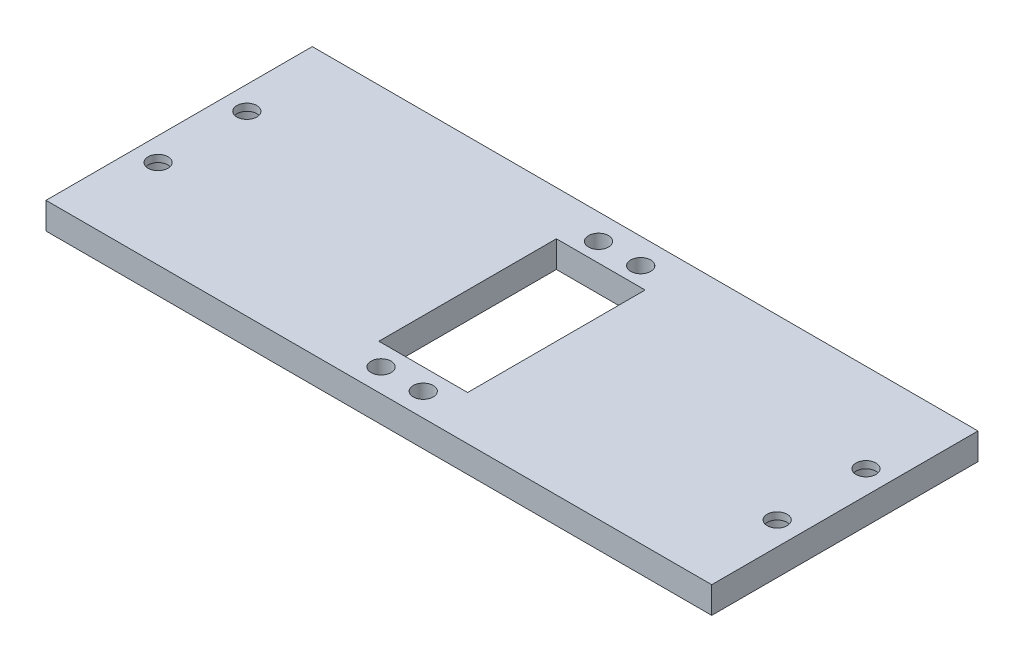
ISO-10303-21;
HEADER;
FILE_DESCRIPTION(('STEP AP214'),'2;1');
FILE_NAME('part.step','',(''),(''),'','','');
FILE_SCHEMA(('AUTOMOTIVE_DESIGN { 1 0 10303 214 1 1 1 1 }'));
ENDSEC;
DATA;
#1=APPLICATION_CONTEXT('core data for automotive mechanical design processes');
#2=APPLICATION_PROTOCOL_DEFINITION('international standard','automotive_design',2000,#1);
#3=PRODUCT_CONTEXT('',#1,'mechanical');
#4=PRODUCT('Part','Part','',(#3));
#5=PRODUCT_RELATED_PRODUCT_CATEGORY('part','',(#4));
#6=PRODUCT_DEFINITION_FORMATION('','',#4);
#7=PRODUCT_DEFINITION_CONTEXT('part definition',#1,'design');
#8=PRODUCT_DEFINITION('design','',#6,#7);
#9=PRODUCT_DEFINITION_SHAPE('','',#8);
#10=(LENGTH_UNIT() NAMED_UNIT(*) SI_UNIT(.MILLI.,.METRE.));
#11=(NAMED_UNIT(*) PLANE_ANGLE_UNIT() SI_UNIT($,.RADIAN.));
#12=(NAMED_UNIT(*) SI_UNIT($,.STERADIAN.) SOLID_ANGLE_UNIT());
#13=UNCERTAINTY_MEASURE_WITH_UNIT(LENGTH_MEASURE(1.E-05),#10,'distance_accuracy_value','');
#14=(GEOMETRIC_REPRESENTATION_CONTEXT(3) GLOBAL_UNCERTAINTY_ASSIGNED_CONTEXT((#13)) GLOBAL_UNIT_ASSIGNED_CONTEXT((#10,
#11,#12)) REPRESENTATION_CONTEXT('',''));
#15=CARTESIAN_POINT('',(0.,0.,0.));
#16=DIRECTION('',(0.,0.,1.));
#17=DIRECTION('',(1.,0.,0.));
#18=AXIS2_PLACEMENT_3D('',#15,#16,#17);
#19=CARTESIAN_POINT('',(0.,6.,0.));
#20=DIRECTION('',(0.,1.,0.));
#21=DIRECTION('',(0.,0.,1.));
#22=AXIS2_PLACEMENT_3D('',#19,#20,#21);
#23=PLANE('',#22);
#24=CARTESIAN_POINT('',(-4.74999999999999,6.00000000000001,24.75));
#25=DIRECTION('',(0.,1.,0.));
#26=DIRECTION('',(0.,0.,1.));
#27=AXIS2_PLACEMENT_3D('',#24,#25,#26);
#28=CIRCLE('',#27,2.24999999999999);
#29=CARTESIAN_POINT('',(-4.74999999999999,6.00000000000001,27.));
#30=VERTEX_POINT('',#29);
#31=EDGE_CURVE('E290',#30,#30,#28,.T.);
#32=ORIENTED_EDGE('',*,*,#31,.F.);
#33=EDGE_LOOP('',(#32));
#34=FACE_BOUND('',#33,.T.);
#35=CARTESIAN_POINT('',(4.75,6.00000000000001,24.75));
#36=DIRECTION('',(0.,1.,0.));
#37=DIRECTION('',(0.,0.,1.));
#38=AXIS2_PLACEMENT_3D('',#35,#36,#37);
#39=CIRCLE('',#38,2.24999999999999);
#40=CARTESIAN_POINT('',(4.75,6.00000000000001,27.));
#41=VERTEX_POINT('',#40);
#42=EDGE_CURVE('E294',#41,#41,#39,.T.);
#43=ORIENTED_EDGE('',*,*,#42,.F.);
#44=EDGE_LOOP('',(#43));
#45=FACE_BOUND('',#44,.T.);
#46=CARTESIAN_POINT('',(4.75000000000001,6.00000000000001,-24.25));
#47=DIRECTION('',(0.,1.,0.));
#48=DIRECTION('',(0.,0.,1.));
#49=AXIS2_PLACEMENT_3D('',#46,#47,#48);
#50=CIRCLE('',#49,2.24999999999999);
#51=CARTESIAN_POINT('',(4.75000000000001,6.00000000000001,-22.));
#52=VERTEX_POINT('',#51);
#53=EDGE_CURVE('E303',#52,#52,#50,.T.);
#54=ORIENTED_EDGE('',*,*,#53,.F.);
#55=EDGE_LOOP('',(#54));
#56=FACE_BOUND('',#55,.T.);
#57=CARTESIAN_POINT('',(-4.74999999999999,6.00000000000001,-24.25));
#58=DIRECTION('',(0.,1.,0.));
#59=DIRECTION('',(0.,0.,1.));
#60=AXIS2_PLACEMENT_3D('',#57,#58,#59);
#61=CIRCLE('',#60,2.24999999999999);
#62=CARTESIAN_POINT('',(-4.74999999999999,6.00000000000001,-22.));
#63=VERTEX_POINT('',#62);
#64=EDGE_CURVE('E306',#63,#63,#61,.T.);
#65=ORIENTED_EDGE('',*,*,#64,.F.);
#66=EDGE_LOOP('',(#65));
#67=FACE_BOUND('',#66,.T.);
#68=CARTESIAN_POINT('',(-69.75,6.00000000000001,9.99999999999995));
#69=DIRECTION('',(0.,-1.,0.));
#70=DIRECTION('',(0.,0.,-1.));
#71=AXIS2_PLACEMENT_3D('',#68,#69,#70);
#72=CIRCLE('',#71,2.25000000000002);
#73=CARTESIAN_POINT('',(-69.75,6.00000000000001,7.74999999999994));
#74=VERTEX_POINT('',#73);
#75=EDGE_CURVE('E321',#74,#74,#72,.T.);
#76=ORIENTED_EDGE('',*,*,#75,.T.);
#77=EDGE_LOOP('',(#76));
#78=FACE_BOUND('',#77,.T.);
#79=CARTESIAN_POINT('',(-69.75,6.00000000000001,-10.0000000000001));
#80=DIRECTION('',(0.,-1.,0.));
#81=DIRECTION('',(0.,0.,-1.));
#82=AXIS2_PLACEMENT_3D('',#79,#80,#81);
#83=CIRCLE('',#82,2.25000000000002);
#84=CARTESIAN_POINT('',(-69.75,6.00000000000001,-12.2500000000001));
#85=VERTEX_POINT('',#84);
#86=EDGE_CURVE('E333',#85,#85,#83,.T.);
#87=ORIENTED_EDGE('',*,*,#86,.T.);
#88=EDGE_LOOP('',(#87));
#89=FACE_BOUND('',#88,.T.);
#90=CARTESIAN_POINT('',(69.75,6.00000000000001,9.99999999999995));
#91=DIRECTION('',(0.,-1.,0.));
#92=DIRECTION('',(0.,0.,-1.));
#93=AXIS2_PLACEMENT_3D('',#90,#91,#92);
#94=CIRCLE('',#93,2.25000000000002);
#95=CARTESIAN_POINT('',(69.75,6.00000000000001,7.74999999999994));
#96=VERTEX_POINT('',#95);
#97=EDGE_CURVE('E345',#96,#96,#94,.T.);
#98=ORIENTED_EDGE('',*,*,#97,.T.);
#99=EDGE_LOOP('',(#98));
#100=FACE_BOUND('',#99,.T.);
#101=CARTESIAN_POINT('',(69.75,6.00000000000001,-10.0000000000001));
#102=DIRECTION('',(0.,-1.,0.));
#103=DIRECTION('',(0.,0.,-1.));
#104=AXIS2_PLACEMENT_3D('',#101,#102,#103);
#105=CIRCLE('',#104,2.25000000000002);
#106=CARTESIAN_POINT('',(69.75,6.00000000000001,-12.2500000000001));
#107=VERTEX_POINT('',#106);
#108=EDGE_CURVE('E132',#107,#107,#105,.T.);
#109=ORIENTED_EDGE('',*,*,#108,.T.);
#110=EDGE_LOOP('',(#109));
#111=FACE_BOUND('',#110,.T.);
#112=DIRECTION('',(0.,0.,1.));
#113=VECTOR('',#112,1.);
#114=CARTESIAN_POINT('',(-75.,6.,30.));
#115=LINE('',#114,#113);
#116=CARTESIAN_POINT('',(-75.,6.,-30.));
#117=VERTEX_POINT('',#116);
#118=CARTESIAN_POINT('',(-75.,6.,30.));
#119=VERTEX_POINT('',#118);
#120=EDGE_CURVE('E142',#117,#119,#115,.T.);
#121=ORIENTED_EDGE('',*,*,#120,.T.);
#122=DIRECTION('',(1.,0.,0.));
#123=VECTOR('',#122,1.);
#124=CARTESIAN_POINT('',(75.,6.,30.));
#125=LINE('',#124,#123);
#126=CARTESIAN_POINT('',(75.,6.,30.));
#127=VERTEX_POINT('',#126);
#128=EDGE_CURVE('E145',#119,#127,#125,.T.);
#129=ORIENTED_EDGE('',*,*,#128,.T.);
#130=DIRECTION('',(0.,0.,-1.));
#131=VECTOR('',#130,1.);
#132=CARTESIAN_POINT('',(75.,6.,30.));
#133=LINE('',#132,#131);
#134=CARTESIAN_POINT('',(75.,6.,-30.));
#135=VERTEX_POINT('',#134);
#136=EDGE_CURVE('E148',#127,#135,#133,.T.);
#137=ORIENTED_EDGE('',*,*,#136,.T.);
#138=DIRECTION('',(-1.,0.,0.));
#139=VECTOR('',#138,1.);
#140=CARTESIAN_POINT('',(75.,6.,-30.));
#141=LINE('',#140,#139);
#142=EDGE_CURVE('E150',#135,#117,#141,.T.);
#143=ORIENTED_EDGE('',*,*,#142,.T.);
#144=EDGE_LOOP('',(#121,#129,#137,#143));
#145=FACE_BOUND('',#144,.T.);
#146=DIRECTION('',(1.,0.,0.));
#147=VECTOR('',#146,1.);
#148=CARTESIAN_POINT('',(10.,6.,20.));
#149=LINE('',#148,#147);
#150=CARTESIAN_POINT('',(-9.99999999999999,6.,20.));
#151=VERTEX_POINT('',#150);
#152=CARTESIAN_POINT('',(10.,6.,20.));
#153=VERTEX_POINT('',#152);
#154=EDGE_CURVE('E112',#151,#153,#149,.T.);
#155=ORIENTED_EDGE('',*,*,#154,.F.);
#156=DIRECTION('',(0.,0.,1.));
#157=VECTOR('',#156,1.);
#158=CARTESIAN_POINT('',(-9.99999999999999,6.,20.));
#159=LINE('',#158,#157);
#160=CARTESIAN_POINT('',(-9.99999999999999,6.,-20.));
#161=VERTEX_POINT('',#160);
#162=EDGE_CURVE('E104',#161,#151,#159,.T.);
#163=ORIENTED_EDGE('',*,*,#162,.F.);
#164=DIRECTION('',(-1.,0.,0.));
#165=VECTOR('',#164,1.);
#166=CARTESIAN_POINT('',(10.,6.,-20.));
#167=LINE('',#166,#165);
#168=CARTESIAN_POINT('',(10.,6.,-20.));
#169=VERTEX_POINT('',#168);
#170=EDGE_CURVE('E126',#169,#161,#167,.T.);
#171=ORIENTED_EDGE('',*,*,#170,.F.);
#172=DIRECTION('',(0.,0.,-1.));
#173=VECTOR('',#172,1.);
#174=CARTESIAN_POINT('',(10.,6.,20.));
#175=LINE('',#174,#173);
#176=EDGE_CURVE('E124',#153,#169,#175,.T.);
#177=ORIENTED_EDGE('',*,*,#176,.F.);
#178=EDGE_LOOP('',(#155,#163,#171,#177));
#179=FACE_BOUND('',#178,.T.);
#180=ADVANCED_FACE('F38',(#34,#45,#56,#67,#78,#89,#100,#111,#145,#179),#23,.T.);
#181=CARTESIAN_POINT('',(0.,0.,0.));
#182=DIRECTION('',(0.,1.,0.));
#183=DIRECTION('',(0.,0.,1.));
#184=AXIS2_PLACEMENT_3D('',#181,#182,#183);
#185=PLANE('',#184);
#186=CARTESIAN_POINT('',(-4.74999999999999,0.,24.75));
#187=DIRECTION('',(0.,1.,0.));
#188=DIRECTION('',(0.,0.,1.));
#189=AXIS2_PLACEMENT_3D('',#186,#187,#188);
#190=CIRCLE('',#189,2.24999999999999);
#191=CARTESIAN_POINT('',(-4.74999999999999,0.,27.));
#192=VERTEX_POINT('',#191);
#193=EDGE_CURVE('E293',#192,#192,#190,.T.);
#194=ORIENTED_EDGE('',*,*,#193,.T.);
#195=EDGE_LOOP('',(#194));
#196=FACE_BOUND('',#195,.T.);
#197=CARTESIAN_POINT('',(4.75,0.,24.75));
#198=DIRECTION('',(0.,1.,0.));
#199=DIRECTION('',(0.,0.,1.));
#200=AXIS2_PLACEMENT_3D('',#197,#198,#199);
#201=CIRCLE('',#200,2.24999999999999);
#202=CARTESIAN_POINT('',(4.75,0.,27.));
#203=VERTEX_POINT('',#202);
#204=EDGE_CURVE('E297',#203,#203,#201,.T.);
#205=ORIENTED_EDGE('',*,*,#204,.T.);
#206=EDGE_LOOP('',(#205));
#207=FACE_BOUND('',#206,.T.);
#208=CARTESIAN_POINT('',(4.75000000000001,0.,-24.25));
#209=DIRECTION('',(0.,1.,0.));
#210=DIRECTION('',(0.,0.,1.));
#211=AXIS2_PLACEMENT_3D('',#208,#209,#210);
#212=CIRCLE('',#211,2.24999999999999);
#213=CARTESIAN_POINT('',(4.75000000000001,0.,-22.));
#214=VERTEX_POINT('',#213);
#215=EDGE_CURVE('E42',#214,#214,#212,.T.);
#216=ORIENTED_EDGE('',*,*,#215,.T.);
#217=EDGE_LOOP('',(#216));
#218=FACE_BOUND('',#217,.T.);
#219=CARTESIAN_POINT('',(-4.74999999999999,0.,-24.25));
#220=DIRECTION('',(0.,1.,0.));
#221=DIRECTION('',(0.,0.,1.));
#222=AXIS2_PLACEMENT_3D('',#219,#220,#221);
#223=CIRCLE('',#222,2.24999999999999);
#224=CARTESIAN_POINT('',(-4.74999999999999,0.,-22.));
#225=VERTEX_POINT('',#224);
#226=EDGE_CURVE('E309',#225,#225,#223,.T.);
#227=ORIENTED_EDGE('',*,*,#226,.T.);
#228=EDGE_LOOP('',(#227));
#229=FACE_BOUND('',#228,.T.);
#230=CARTESIAN_POINT('',(-69.75,0.,9.99999999999995));
#231=DIRECTION('',(0.,-1.,0.));
#232=DIRECTION('',(0.,0.,-1.));
#233=AXIS2_PLACEMENT_3D('',#230,#231,#232);
#234=CIRCLE('',#233,3.99999999999999);
#235=CARTESIAN_POINT('',(-69.75,0.,5.99999999999996));
#236=VERTEX_POINT('',#235);
#237=EDGE_CURVE('E312',#236,#236,#234,.T.);
#238=ORIENTED_EDGE('',*,*,#237,.F.);
#239=EDGE_LOOP('',(#238));
#240=FACE_BOUND('',#239,.T.);
#241=CARTESIAN_POINT('',(-69.75,0.,-10.0000000000001));
#242=DIRECTION('',(0.,-1.,0.));
#243=DIRECTION('',(0.,0.,-1.));
#244=AXIS2_PLACEMENT_3D('',#241,#242,#243);
#245=CIRCLE('',#244,3.99999999999999);
#246=CARTESIAN_POINT('',(-69.75,0.,-14.0000000000001));
#247=VERTEX_POINT('',#246);
#248=EDGE_CURVE('E324',#247,#247,#245,.T.);
#249=ORIENTED_EDGE('',*,*,#248,.F.);
#250=EDGE_LOOP('',(#249));
#251=FACE_BOUND('',#250,.T.);
#252=CARTESIAN_POINT('',(69.75,0.,9.99999999999995));
#253=DIRECTION('',(0.,-1.,0.));
#254=DIRECTION('',(0.,0.,-1.));
#255=AXIS2_PLACEMENT_3D('',#252,#253,#254);
#256=CIRCLE('',#255,3.99999999999999);
#257=CARTESIAN_POINT('',(69.75,0.,5.99999999999996));
#258=VERTEX_POINT('',#257);
#259=EDGE_CURVE('E336',#258,#258,#256,.T.);
#260=ORIENTED_EDGE('',*,*,#259,.F.);
#261=EDGE_LOOP('',(#260));
#262=FACE_BOUND('',#261,.T.);
#263=CARTESIAN_POINT('',(69.75,0.,-10.0000000000001));
#264=DIRECTION('',(0.,-1.,0.));
#265=DIRECTION('',(0.,0.,-1.));
#266=AXIS2_PLACEMENT_3D('',#263,#264,#265);
#267=CIRCLE('',#266,3.99999999999999);
#268=CARTESIAN_POINT('',(69.75,0.,-14.0000000000001));
#269=VERTEX_POINT('',#268);
#270=EDGE_CURVE('E348',#269,#269,#267,.T.);
#271=ORIENTED_EDGE('',*,*,#270,.F.);
#272=EDGE_LOOP('',(#271));
#273=FACE_BOUND('',#272,.T.);
#274=DIRECTION('',(0.,0.,1.));
#275=VECTOR('',#274,1.);
#276=CARTESIAN_POINT('',(-75.,0.,30.));
#277=LINE('',#276,#275);
#278=CARTESIAN_POINT('',(-75.,0.,-30.));
#279=VERTEX_POINT('',#278);
#280=CARTESIAN_POINT('',(-75.,0.,30.));
#281=VERTEX_POINT('',#280);
#282=EDGE_CURVE('E120',#279,#281,#277,.T.);
#283=ORIENTED_EDGE('',*,*,#282,.F.);
#284=DIRECTION('',(-1.,0.,0.));
#285=VECTOR('',#284,1.);
#286=CARTESIAN_POINT('',(75.,0.,-30.));
#287=LINE('',#286,#285);
#288=CARTESIAN_POINT('',(75.,0.,-30.));
#289=VERTEX_POINT('',#288);
#290=EDGE_CURVE('E146',#289,#279,#287,.T.);
#291=ORIENTED_EDGE('',*,*,#290,.F.);
#292=DIRECTION('',(0.,0.,-1.));
#293=VECTOR('',#292,1.);
#294=CARTESIAN_POINT('',(75.,0.,30.));
#295=LINE('',#294,#293);
#296=CARTESIAN_POINT('',(75.,0.,30.));
#297=VERTEX_POINT('',#296);
#298=EDGE_CURVE('E157',#297,#289,#295,.T.);
#299=ORIENTED_EDGE('',*,*,#298,.F.);
#300=DIRECTION('',(1.,0.,0.));
#301=VECTOR('',#300,1.);
#302=CARTESIAN_POINT('',(75.,0.,30.));
#303=LINE('',#302,#301);
#304=EDGE_CURVE('E155',#281,#297,#303,.T.);
#305=ORIENTED_EDGE('',*,*,#304,.F.);
#306=EDGE_LOOP('',(#283,#291,#299,#305));
#307=FACE_BOUND('',#306,.T.);
#308=DIRECTION('',(0.,0.,1.));
#309=VECTOR('',#308,1.);
#310=CARTESIAN_POINT('',(-9.99999999999999,0.,20.));
#311=LINE('',#310,#309);
#312=CARTESIAN_POINT('',(-9.99999999999999,0.,-20.));
#313=VERTEX_POINT('',#312);
#314=CARTESIAN_POINT('',(-9.99999999999999,0.,20.));
#315=VERTEX_POINT('',#314);
#316=EDGE_CURVE('E62',#313,#315,#311,.T.);
#317=ORIENTED_EDGE('',*,*,#316,.T.);
#318=DIRECTION('',(1.,0.,0.));
#319=VECTOR('',#318,1.);
#320=CARTESIAN_POINT('',(10.,0.,20.));
#321=LINE('',#320,#319);
#322=CARTESIAN_POINT('',(10.,0.,20.));
#323=VERTEX_POINT('',#322);
#324=EDGE_CURVE('E119',#315,#323,#321,.T.);
#325=ORIENTED_EDGE('',*,*,#324,.T.);
#326=DIRECTION('',(0.,0.,-1.));
#327=VECTOR('',#326,1.);
#328=CARTESIAN_POINT('',(10.,0.,20.));
#329=LINE('',#328,#327);
#330=CARTESIAN_POINT('',(10.,0.,-20.));
#331=VERTEX_POINT('',#330);
#332=EDGE_CURVE('E134',#323,#331,#329,.T.);
#333=ORIENTED_EDGE('',*,*,#332,.T.);
#334=DIRECTION('',(-1.,0.,0.));
#335=VECTOR('',#334,1.);
#336=CARTESIAN_POINT('',(10.,0.,-20.));
#337=LINE('',#336,#335);
#338=EDGE_CURVE('E113',#331,#313,#337,.T.);
#339=ORIENTED_EDGE('',*,*,#338,.T.);
#340=EDGE_LOOP('',(#317,#325,#333,#339));
#341=FACE_BOUND('',#340,.T.);
#342=ADVANCED_FACE('F176',(#196,#207,#218,#229,#240,#251,#262,#273,#307,#341),#185,.F.);
#343=CARTESIAN_POINT('',(-75.,6.,30.));
#344=DIRECTION('',(1.,0.,0.));
#345=DIRECTION('',(0.,0.,-1.));
#346=AXIS2_PLACEMENT_3D('',#343,#344,#345);
#347=PLANE('',#346);
#348=ORIENTED_EDGE('',*,*,#282,.T.);
#349=DIRECTION('',(0.,-1.,0.));
#350=VECTOR('',#349,1.);
#351=CARTESIAN_POINT('',(-75.,6.,30.));
#352=LINE('',#351,#350);
#353=EDGE_CURVE('E11',#119,#281,#352,.T.);
#354=ORIENTED_EDGE('',*,*,#353,.F.);
#355=ORIENTED_EDGE('',*,*,#120,.F.);
#356=DIRECTION('',(0.,-1.,0.));
#357=VECTOR('',#356,1.);
#358=CARTESIAN_POINT('',(-75.,6.,-30.));
#359=LINE('',#358,#357);
#360=EDGE_CURVE('E152',#117,#279,#359,.T.);
#361=ORIENTED_EDGE('',*,*,#360,.T.);
#362=EDGE_LOOP('',(#348,#354,#355,#361));
#363=FACE_BOUND('',#362,.T.);
#364=ADVANCED_FACE('F40',(#363),#347,.F.);
#365=CARTESIAN_POINT('',(75.,6.,30.));
#366=DIRECTION('',(0.,0.,-1.));
#367=DIRECTION('',(-1.,0.,0.));
#368=AXIS2_PLACEMENT_3D('',#365,#366,#367);
#369=PLANE('',#368);
#370=ORIENTED_EDGE('',*,*,#304,.T.);
#371=DIRECTION('',(0.,-1.,0.));
#372=VECTOR('',#371,1.);
#373=CARTESIAN_POINT('',(75.,6.,30.));
#374=LINE('',#373,#372);
#375=EDGE_CURVE('E47',#127,#297,#374,.T.);
#376=ORIENTED_EDGE('',*,*,#375,.F.);
#377=ORIENTED_EDGE('',*,*,#128,.F.);
#378=ORIENTED_EDGE('',*,*,#353,.T.);
#379=EDGE_LOOP('',(#370,#376,#377,#378));
#380=FACE_BOUND('',#379,.T.);
#381=ADVANCED_FACE('F186',(#380),#369,.F.);
#382=CARTESIAN_POINT('',(75.,6.,30.));
#383=DIRECTION('',(-1.,0.,0.));
#384=DIRECTION('',(0.,0.,1.));
#385=AXIS2_PLACEMENT_3D('',#382,#383,#384);
#386=PLANE('',#385);
#387=ORIENTED_EDGE('',*,*,#298,.T.);
#388=DIRECTION('',(0.,-1.,0.));
#389=VECTOR('',#388,1.);
#390=CARTESIAN_POINT('',(75.,6.,-30.));
#391=LINE('',#390,#389);
#392=EDGE_CURVE('E162',#135,#289,#391,.T.);
#393=ORIENTED_EDGE('',*,*,#392,.F.);
#394=ORIENTED_EDGE('',*,*,#136,.F.);
#395=ORIENTED_EDGE('',*,*,#375,.T.);
#396=EDGE_LOOP('',(#387,#393,#394,#395));
#397=FACE_BOUND('',#396,.T.);
#398=ADVANCED_FACE('F170',(#397),#386,.F.);
#399=CARTESIAN_POINT('',(75.,6.,-30.));
#400=DIRECTION('',(0.,0.,1.));
#401=DIRECTION('',(1.,0.,0.));
#402=AXIS2_PLACEMENT_3D('',#399,#400,#401);
#403=PLANE('',#402);
#404=ORIENTED_EDGE('',*,*,#290,.T.);
#405=ORIENTED_EDGE('',*,*,#360,.F.);
#406=ORIENTED_EDGE('',*,*,#142,.F.);
#407=ORIENTED_EDGE('',*,*,#392,.T.);
#408=EDGE_LOOP('',(#404,#405,#406,#407));
#409=FACE_BOUND('',#408,.T.);
#410=ADVANCED_FACE('F180',(#409),#403,.F.);
#411=CARTESIAN_POINT('',(-9.99999999999999,6.,20.));
#412=DIRECTION('',(1.,0.,0.));
#413=DIRECTION('',(0.,0.,-1.));
#414=AXIS2_PLACEMENT_3D('',#411,#412,#413);
#415=PLANE('',#414);
#416=ORIENTED_EDGE('',*,*,#316,.F.);
#417=DIRECTION('',(0.,-1.,0.));
#418=VECTOR('',#417,1.);
#419=CARTESIAN_POINT('',(-9.99999999999999,6.,-20.));
#420=LINE('',#419,#418);
#421=EDGE_CURVE('E108',#161,#313,#420,.T.);
#422=ORIENTED_EDGE('',*,*,#421,.F.);
#423=ORIENTED_EDGE('',*,*,#162,.T.);
#424=DIRECTION('',(0.,-1.,0.));
#425=VECTOR('',#424,1.);
#426=CARTESIAN_POINT('',(-9.99999999999999,6.,20.));
#427=LINE('',#426,#425);
#428=EDGE_CURVE('E107',#151,#315,#427,.T.);
#429=ORIENTED_EDGE('',*,*,#428,.T.);
#430=EDGE_LOOP('',(#416,#422,#423,#429));
#431=FACE_BOUND('',#430,.T.);
#432=ADVANCED_FACE('F106',(#431),#415,.T.);
#433=CARTESIAN_POINT('',(10.,6.,20.));
#434=DIRECTION('',(0.,0.,-1.));
#435=DIRECTION('',(-1.,0.,0.));
#436=AXIS2_PLACEMENT_3D('',#433,#434,#435);
#437=PLANE('',#436);
#438=ORIENTED_EDGE('',*,*,#324,.F.);
#439=ORIENTED_EDGE('',*,*,#428,.F.);
#440=ORIENTED_EDGE('',*,*,#154,.T.);
#441=DIRECTION('',(0.,-1.,0.));
#442=VECTOR('',#441,1.);
#443=CARTESIAN_POINT('',(10.,6.,20.));
#444=LINE('',#443,#442);
#445=EDGE_CURVE('E121',#153,#323,#444,.T.);
#446=ORIENTED_EDGE('',*,*,#445,.T.);
#447=EDGE_LOOP('',(#438,#439,#440,#446));
#448=FACE_BOUND('',#447,.T.);
#449=ADVANCED_FACE('F116',(#448),#437,.T.);
#450=CARTESIAN_POINT('',(10.,6.,20.));
#451=DIRECTION('',(-1.,0.,0.));
#452=DIRECTION('',(0.,0.,1.));
#453=AXIS2_PLACEMENT_3D('',#450,#451,#452);
#454=PLANE('',#453);
#455=ORIENTED_EDGE('',*,*,#332,.F.);
#456=ORIENTED_EDGE('',*,*,#445,.F.);
#457=ORIENTED_EDGE('',*,*,#176,.T.);
#458=DIRECTION('',(0.,-1.,0.));
#459=VECTOR('',#458,1.);
#460=CARTESIAN_POINT('',(10.,6.,-20.));
#461=LINE('',#460,#459);
#462=EDGE_CURVE('E54',#169,#331,#461,.T.);
#463=ORIENTED_EDGE('',*,*,#462,.T.);
#464=EDGE_LOOP('',(#455,#456,#457,#463));
#465=FACE_BOUND('',#464,.T.);
#466=ADVANCED_FACE('F213',(#465),#454,.T.);
#467=CARTESIAN_POINT('',(10.,6.,-20.));
#468=DIRECTION('',(0.,0.,1.));
#469=DIRECTION('',(1.,0.,0.));
#470=AXIS2_PLACEMENT_3D('',#467,#468,#469);
#471=PLANE('',#470);
#472=ORIENTED_EDGE('',*,*,#338,.F.);
#473=ORIENTED_EDGE('',*,*,#462,.F.);
#474=ORIENTED_EDGE('',*,*,#170,.T.);
#475=ORIENTED_EDGE('',*,*,#421,.T.);
#476=EDGE_LOOP('',(#472,#473,#474,#475));
#477=FACE_BOUND('',#476,.T.);
#478=ADVANCED_FACE('F217',(#477),#471,.T.);
#479=CARTESIAN_POINT('',(69.75,0.,-10.0000000000001));
#480=DIRECTION('',(0.,-1.,0.));
#481=DIRECTION('',(0.,0.,-1.));
#482=AXIS2_PLACEMENT_3D('',#479,#480,#481);
#483=CYLINDRICAL_SURFACE('',#482,2.25000000000002);
#484=ORIENTED_EDGE('',*,*,#108,.F.);
#485=EDGE_LOOP('',(#484));
#486=FACE_BOUND('',#485,.T.);
#487=CARTESIAN_POINT('',(69.75,4.4,-10.0000000000001));
#488=DIRECTION('',(0.,-1.,0.));
#489=DIRECTION('',(0.,0.,-1.));
#490=AXIS2_PLACEMENT_3D('',#487,#488,#489);
#491=CIRCLE('',#490,2.25000000000002);
#492=CARTESIAN_POINT('',(69.75,4.4,-12.2500000000001));
#493=VERTEX_POINT('',#492);
#494=EDGE_CURVE('E354',#493,#493,#491,.T.);
#495=ORIENTED_EDGE('',*,*,#494,.T.);
#496=EDGE_LOOP('',(#495));
#497=FACE_BOUND('',#496,.T.);
#498=ADVANCED_FACE('F223',(#486,#497),#483,.F.);
#499=CARTESIAN_POINT('',(72.,4.4,-10.0000000000001));
#500=DIRECTION('',(0.,1.,0.));
#501=DIRECTION('',(0.,0.,1.));
#502=AXIS2_PLACEMENT_3D('',#499,#500,#501);
#503=PLANE('',#502);
#504=ORIENTED_EDGE('',*,*,#494,.F.);
#505=EDGE_LOOP('',(#504));
#506=FACE_BOUND('',#505,.T.);
#507=CARTESIAN_POINT('',(69.75,4.4,-10.0000000000001));
#508=DIRECTION('',(0.,-1.,0.));
#509=DIRECTION('',(0.,0.,-1.));
#510=AXIS2_PLACEMENT_3D('',#507,#508,#509);
#511=CIRCLE('',#510,3.99999999999999);
#512=CARTESIAN_POINT('',(69.75,4.4,-14.0000000000001));
#513=VERTEX_POINT('',#512);
#514=EDGE_CURVE('E351',#513,#513,#511,.T.);
#515=ORIENTED_EDGE('',*,*,#514,.T.);
#516=EDGE_LOOP('',(#515));
#517=FACE_BOUND('',#516,.T.);
#518=ADVANCED_FACE('F226',(#506,#517),#503,.F.);
#519=CARTESIAN_POINT('',(69.75,0.,-10.0000000000001));
#520=DIRECTION('',(0.,-1.,0.));
#521=DIRECTION('',(0.,0.,-1.));
#522=AXIS2_PLACEMENT_3D('',#519,#520,#521);
#523=CYLINDRICAL_SURFACE('',#522,3.99999999999999);
#524=ORIENTED_EDGE('',*,*,#514,.F.);
#525=EDGE_LOOP('',(#524));
#526=FACE_BOUND('',#525,.T.);
#527=ORIENTED_EDGE('',*,*,#270,.T.);
#528=EDGE_LOOP('',(#527));
#529=FACE_BOUND('',#528,.T.);
#530=ADVANCED_FACE('F230',(#526,#529),#523,.F.);
#531=CARTESIAN_POINT('',(69.75,0.,9.99999999999995));
#532=DIRECTION('',(0.,-1.,0.));
#533=DIRECTION('',(0.,0.,-1.));
#534=AXIS2_PLACEMENT_3D('',#531,#532,#533);
#535=CYLINDRICAL_SURFACE('',#534,2.25000000000002);
#536=ORIENTED_EDGE('',*,*,#97,.F.);
#537=EDGE_LOOP('',(#536));
#538=FACE_BOUND('',#537,.T.);
#539=CARTESIAN_POINT('',(69.75,4.4,9.99999999999995));
#540=DIRECTION('',(0.,-1.,0.));
#541=DIRECTION('',(0.,0.,-1.));
#542=AXIS2_PLACEMENT_3D('',#539,#540,#541);
#543=CIRCLE('',#542,2.25000000000002);
#544=CARTESIAN_POINT('',(69.75,4.4,7.74999999999994));
#545=VERTEX_POINT('',#544);
#546=EDGE_CURVE('E342',#545,#545,#543,.T.);
#547=ORIENTED_EDGE('',*,*,#546,.T.);
#548=EDGE_LOOP('',(#547));
#549=FACE_BOUND('',#548,.T.);
#550=ADVANCED_FACE('F234',(#538,#549),#535,.F.);
#551=CARTESIAN_POINT('',(72.,4.4,9.99999999999995));
#552=DIRECTION('',(0.,1.,0.));
#553=DIRECTION('',(0.,0.,1.));
#554=AXIS2_PLACEMENT_3D('',#551,#552,#553);
#555=PLANE('',#554);
#556=ORIENTED_EDGE('',*,*,#546,.F.);
#557=EDGE_LOOP('',(#556));
#558=FACE_BOUND('',#557,.T.);
#559=CARTESIAN_POINT('',(69.75,4.4,9.99999999999995));
#560=DIRECTION('',(0.,-1.,0.));
#561=DIRECTION('',(0.,0.,-1.));
#562=AXIS2_PLACEMENT_3D('',#559,#560,#561);
#563=CIRCLE('',#562,3.99999999999999);
#564=CARTESIAN_POINT('',(69.75,4.4,5.99999999999996));
#565=VERTEX_POINT('',#564);
#566=EDGE_CURVE('E339',#565,#565,#563,.T.);
#567=ORIENTED_EDGE('',*,*,#566,.T.);
#568=EDGE_LOOP('',(#567));
#569=FACE_BOUND('',#568,.T.);
#570=ADVANCED_FACE('F238',(#558,#569),#555,.F.);
#571=CARTESIAN_POINT('',(69.75,0.,9.99999999999995));
#572=DIRECTION('',(0.,-1.,0.));
#573=DIRECTION('',(0.,0.,-1.));
#574=AXIS2_PLACEMENT_3D('',#571,#572,#573);
#575=CYLINDRICAL_SURFACE('',#574,3.99999999999999);
#576=ORIENTED_EDGE('',*,*,#566,.F.);
#577=EDGE_LOOP('',(#576));
#578=FACE_BOUND('',#577,.T.);
#579=ORIENTED_EDGE('',*,*,#259,.T.);
#580=EDGE_LOOP('',(#579));
#581=FACE_BOUND('',#580,.T.);
#582=ADVANCED_FACE('F242',(#578,#581),#575,.F.);
#583=CARTESIAN_POINT('',(-69.75,0.,-10.0000000000001));
#584=DIRECTION('',(0.,-1.,0.));
#585=DIRECTION('',(0.,0.,-1.));
#586=AXIS2_PLACEMENT_3D('',#583,#584,#585);
#587=CYLINDRICAL_SURFACE('',#586,2.25000000000002);
#588=ORIENTED_EDGE('',*,*,#86,.F.);
#589=EDGE_LOOP('',(#588));
#590=FACE_BOUND('',#589,.T.);
#591=CARTESIAN_POINT('',(-69.75,4.4,-10.0000000000001));
#592=DIRECTION('',(0.,-1.,0.));
#593=DIRECTION('',(0.,0.,-1.));
#594=AXIS2_PLACEMENT_3D('',#591,#592,#593);
#595=CIRCLE('',#594,2.25000000000002);
#596=CARTESIAN_POINT('',(-69.75,4.4,-12.2500000000001));
#597=VERTEX_POINT('',#596);
#598=EDGE_CURVE('E330',#597,#597,#595,.T.);
#599=ORIENTED_EDGE('',*,*,#598,.T.);
#600=EDGE_LOOP('',(#599));
#601=FACE_BOUND('',#600,.T.);
#602=ADVANCED_FACE('F246',(#590,#601),#587,.F.);
#603=CARTESIAN_POINT('',(-67.5,4.4,-10.0000000000001));
#604=DIRECTION('',(0.,1.,0.));
#605=DIRECTION('',(0.,0.,1.));
#606=AXIS2_PLACEMENT_3D('',#603,#604,#605);
#607=PLANE('',#606);
#608=ORIENTED_EDGE('',*,*,#598,.F.);
#609=EDGE_LOOP('',(#608));
#610=FACE_BOUND('',#609,.T.);
#611=CARTESIAN_POINT('',(-69.75,4.4,-10.0000000000001));
#612=DIRECTION('',(0.,-1.,0.));
#613=DIRECTION('',(0.,0.,-1.));
#614=AXIS2_PLACEMENT_3D('',#611,#612,#613);
#615=CIRCLE('',#614,3.99999999999999);
#616=CARTESIAN_POINT('',(-69.75,4.4,-14.0000000000001));
#617=VERTEX_POINT('',#616);
#618=EDGE_CURVE('E327',#617,#617,#615,.T.);
#619=ORIENTED_EDGE('',*,*,#618,.T.);
#620=EDGE_LOOP('',(#619));
#621=FACE_BOUND('',#620,.T.);
#622=ADVANCED_FACE('F250',(#610,#621),#607,.F.);
#623=CARTESIAN_POINT('',(-69.75,0.,-10.0000000000001));
#624=DIRECTION('',(0.,-1.,0.));
#625=DIRECTION('',(0.,0.,-1.));
#626=AXIS2_PLACEMENT_3D('',#623,#624,#625);
#627=CYLINDRICAL_SURFACE('',#626,3.99999999999999);
#628=ORIENTED_EDGE('',*,*,#618,.F.);
#629=EDGE_LOOP('',(#628));
#630=FACE_BOUND('',#629,.T.);
#631=ORIENTED_EDGE('',*,*,#248,.T.);
#632=EDGE_LOOP('',(#631));
#633=FACE_BOUND('',#632,.T.);
#634=ADVANCED_FACE('F254',(#630,#633),#627,.F.);
#635=CARTESIAN_POINT('',(-69.75,0.,9.99999999999995));
#636=DIRECTION('',(0.,-1.,0.));
#637=DIRECTION('',(0.,0.,-1.));
#638=AXIS2_PLACEMENT_3D('',#635,#636,#637);
#639=CYLINDRICAL_SURFACE('',#638,2.25000000000002);
#640=ORIENTED_EDGE('',*,*,#75,.F.);
#641=EDGE_LOOP('',(#640));
#642=FACE_BOUND('',#641,.T.);
#643=CARTESIAN_POINT('',(-69.75,4.4,9.99999999999995));
#644=DIRECTION('',(0.,-1.,0.));
#645=DIRECTION('',(0.,0.,-1.));
#646=AXIS2_PLACEMENT_3D('',#643,#644,#645);
#647=CIRCLE('',#646,2.25000000000002);
#648=CARTESIAN_POINT('',(-69.75,4.4,7.74999999999994));
#649=VERTEX_POINT('',#648);
#650=EDGE_CURVE('E318',#649,#649,#647,.T.);
#651=ORIENTED_EDGE('',*,*,#650,.T.);
#652=EDGE_LOOP('',(#651));
#653=FACE_BOUND('',#652,.T.);
#654=ADVANCED_FACE('F258',(#642,#653),#639,.F.);
#655=CARTESIAN_POINT('',(-67.5,4.4,9.99999999999995));
#656=DIRECTION('',(0.,1.,0.));
#657=DIRECTION('',(0.,0.,1.));
#658=AXIS2_PLACEMENT_3D('',#655,#656,#657);
#659=PLANE('',#658);
#660=ORIENTED_EDGE('',*,*,#650,.F.);
#661=EDGE_LOOP('',(#660));
#662=FACE_BOUND('',#661,.T.);
#663=CARTESIAN_POINT('',(-69.75,4.4,9.99999999999995));
#664=DIRECTION('',(0.,-1.,0.));
#665=DIRECTION('',(0.,0.,-1.));
#666=AXIS2_PLACEMENT_3D('',#663,#664,#665);
#667=CIRCLE('',#666,3.99999999999999);
#668=CARTESIAN_POINT('',(-69.75,4.4,5.99999999999996));
#669=VERTEX_POINT('',#668);
#670=EDGE_CURVE('E315',#669,#669,#667,.T.);
#671=ORIENTED_EDGE('',*,*,#670,.T.);
#672=EDGE_LOOP('',(#671));
#673=FACE_BOUND('',#672,.T.);
#674=ADVANCED_FACE('F262',(#662,#673),#659,.F.);
#675=CARTESIAN_POINT('',(-69.75,0.,9.99999999999995));
#676=DIRECTION('',(0.,-1.,0.));
#677=DIRECTION('',(0.,0.,-1.));
#678=AXIS2_PLACEMENT_3D('',#675,#676,#677);
#679=CYLINDRICAL_SURFACE('',#678,3.99999999999999);
#680=ORIENTED_EDGE('',*,*,#670,.F.);
#681=EDGE_LOOP('',(#680));
#682=FACE_BOUND('',#681,.T.);
#683=ORIENTED_EDGE('',*,*,#237,.T.);
#684=EDGE_LOOP('',(#683));
#685=FACE_BOUND('',#684,.T.);
#686=ADVANCED_FACE('F266',(#682,#685),#679,.F.);
#687=CARTESIAN_POINT('',(-4.74999999999999,6.00000000000001,-24.25));
#688=DIRECTION('',(0.,1.,0.));
#689=DIRECTION('',(0.,0.,1.));
#690=AXIS2_PLACEMENT_3D('',#687,#688,#689);
#691=CYLINDRICAL_SURFACE('',#690,2.24999999999999);
#692=ORIENTED_EDGE('',*,*,#64,.T.);
#693=EDGE_LOOP('',(#692));
#694=FACE_BOUND('',#693,.T.);
#695=ORIENTED_EDGE('',*,*,#226,.F.);
#696=EDGE_LOOP('',(#695));
#697=FACE_BOUND('',#696,.T.);
#698=ADVANCED_FACE('F270',(#694,#697),#691,.F.);
#699=CARTESIAN_POINT('',(4.75000000000001,6.00000000000001,-24.25));
#700=DIRECTION('',(0.,1.,0.));
#701=DIRECTION('',(0.,0.,1.));
#702=AXIS2_PLACEMENT_3D('',#699,#700,#701);
#703=CYLINDRICAL_SURFACE('',#702,2.24999999999999);
#704=ORIENTED_EDGE('',*,*,#53,.T.);
#705=EDGE_LOOP('',(#704));
#706=FACE_BOUND('',#705,.T.);
#707=ORIENTED_EDGE('',*,*,#215,.F.);
#708=EDGE_LOOP('',(#707));
#709=FACE_BOUND('',#708,.T.);
#710=ADVANCED_FACE('F274',(#706,#709),#703,.F.);
#711=CARTESIAN_POINT('',(4.75,6.00000000000001,24.75));
#712=DIRECTION('',(0.,1.,0.));
#713=DIRECTION('',(0.,0.,1.));
#714=AXIS2_PLACEMENT_3D('',#711,#712,#713);
#715=CYLINDRICAL_SURFACE('',#714,2.24999999999999);
#716=ORIENTED_EDGE('',*,*,#42,.T.);
#717=EDGE_LOOP('',(#716));
#718=FACE_BOUND('',#717,.T.);
#719=ORIENTED_EDGE('',*,*,#204,.F.);
#720=EDGE_LOOP('',(#719));
#721=FACE_BOUND('',#720,.T.);
#722=ADVANCED_FACE('F278',(#718,#721),#715,.F.);
#723=CARTESIAN_POINT('',(-4.74999999999999,6.00000000000001,24.75));
#724=DIRECTION('',(0.,1.,0.));
#725=DIRECTION('',(0.,0.,1.));
#726=AXIS2_PLACEMENT_3D('',#723,#724,#725);
#727=CYLINDRICAL_SURFACE('',#726,2.24999999999999);
#728=ORIENTED_EDGE('',*,*,#31,.T.);
#729=EDGE_LOOP('',(#728));
#730=FACE_BOUND('',#729,.T.);
#731=ORIENTED_EDGE('',*,*,#193,.F.);
#732=EDGE_LOOP('',(#731));
#733=FACE_BOUND('',#732,.T.);
#734=ADVANCED_FACE('F282',(#730,#733),#727,.F.);
#735=CLOSED_SHELL('',(#180,#342,#364,#381,#398,#410,#432,#449,#466,#478,#498,#518,#530,#550,
#570,#582,#602,#622,#634,#654,#674,#686,#698,#710,#722,#734));
#736=MANIFOLD_SOLID_BREP('B2',#735);
#737=ADVANCED_BREP_SHAPE_REPRESENTATION('',(#18,#736),#14);
#738=SHAPE_DEFINITION_REPRESENTATION(#9,#737);
ENDSEC;
END-ISO-10303-21;
